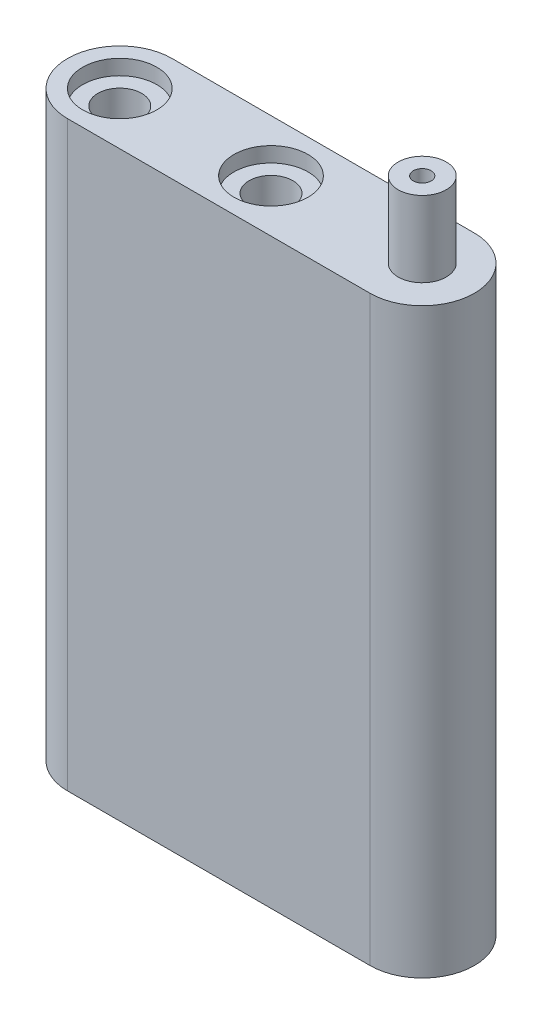
ISO-10303-21;
HEADER;
FILE_DESCRIPTION(('STEP AP214'),'2;1');
FILE_NAME('part.step','',(''),(''),'','','');
FILE_SCHEMA(('AUTOMOTIVE_DESIGN { 1 0 10303 214 1 1 1 1 }'));
ENDSEC;
DATA;
#1=APPLICATION_CONTEXT('core data for automotive mechanical design processes');
#2=APPLICATION_PROTOCOL_DEFINITION('international standard','automotive_design',2000,#1);
#3=PRODUCT_CONTEXT('',#1,'mechanical');
#4=PRODUCT('Part','Part','',(#3));
#5=PRODUCT_RELATED_PRODUCT_CATEGORY('part','',(#4));
#6=PRODUCT_DEFINITION_FORMATION('','',#4);
#7=PRODUCT_DEFINITION_CONTEXT('part definition',#1,'design');
#8=PRODUCT_DEFINITION('design','',#6,#7);
#9=PRODUCT_DEFINITION_SHAPE('','',#8);
#10=(LENGTH_UNIT() NAMED_UNIT(*) SI_UNIT(.MILLI.,.METRE.));
#11=(NAMED_UNIT(*) PLANE_ANGLE_UNIT() SI_UNIT($,.RADIAN.));
#12=(NAMED_UNIT(*) SI_UNIT($,.STERADIAN.) SOLID_ANGLE_UNIT());
#13=UNCERTAINTY_MEASURE_WITH_UNIT(LENGTH_MEASURE(1.E-05),#10,'distance_accuracy_value','');
#14=(GEOMETRIC_REPRESENTATION_CONTEXT(3) GLOBAL_UNCERTAINTY_ASSIGNED_CONTEXT((#13)) GLOBAL_UNIT_ASSIGNED_CONTEXT((#10,
#11,#12)) REPRESENTATION_CONTEXT('',''));
#15=CARTESIAN_POINT('',(0.,0.,0.));
#16=DIRECTION('',(0.,0.,1.));
#17=DIRECTION('',(1.,0.,0.));
#18=AXIS2_PLACEMENT_3D('',#15,#16,#17);
#19=CARTESIAN_POINT('',(0.,2.5,0.));
#20=DIRECTION('',(0.,-1.,0.));
#21=DIRECTION('',(0.,0.,-1.));
#22=AXIS2_PLACEMENT_3D('',#19,#20,#21);
#23=CYLINDRICAL_SURFACE('',#22,1.45);
#24=CARTESIAN_POINT('',(0.,1.5,0.));
#25=DIRECTION('',(0.,1.,0.));
#26=DIRECTION('',(0.,0.,1.));
#27=AXIS2_PLACEMENT_3D('',#24,#25,#26);
#28=CIRCLE('',#27,1.45);
#29=CARTESIAN_POINT('',(0.,1.5,1.45));
#30=VERTEX_POINT('',#29);
#31=EDGE_CURVE('E141',#30,#30,#28,.T.);
#32=ORIENTED_EDGE('',*,*,#31,.T.);
#33=EDGE_LOOP('',(#32));
#34=FACE_BOUND('',#33,.T.);
#35=CARTESIAN_POINT('',(0.,-36.,0.));
#36=DIRECTION('',(0.,-1.,0.));
#37=DIRECTION('',(0.,0.,-1.));
#38=AXIS2_PLACEMENT_3D('',#35,#36,#37);
#39=CIRCLE('',#38,1.45);
#40=CARTESIAN_POINT('',(0.,-36.,-1.45));
#41=VERTEX_POINT('',#40);
#42=EDGE_CURVE('E102',#41,#41,#39,.T.);
#43=ORIENTED_EDGE('',*,*,#42,.T.);
#44=EDGE_LOOP('',(#43));
#45=FACE_BOUND('',#44,.T.);
#46=ADVANCED_FACE('F39',(#34,#45),#23,.F.);
#47=CARTESIAN_POINT('',(10.,2.5,0.));
#48=DIRECTION('',(0.,-1.,0.));
#49=DIRECTION('',(0.,0.,-1.));
#50=AXIS2_PLACEMENT_3D('',#47,#48,#49);
#51=CYLINDRICAL_SURFACE('',#50,1.45);
#52=CARTESIAN_POINT('',(10.,1.5,0.));
#53=DIRECTION('',(0.,1.,0.));
#54=DIRECTION('',(0.,0.,1.));
#55=AXIS2_PLACEMENT_3D('',#52,#53,#54);
#56=CIRCLE('',#55,1.45);
#57=CARTESIAN_POINT('',(10.,1.5,1.45));
#58=VERTEX_POINT('',#57);
#59=EDGE_CURVE('E130',#58,#58,#56,.T.);
#60=ORIENTED_EDGE('',*,*,#59,.T.);
#61=EDGE_LOOP('',(#60));
#62=FACE_BOUND('',#61,.T.);
#63=CARTESIAN_POINT('',(10.,-36.,0.));
#64=DIRECTION('',(0.,-1.,0.));
#65=DIRECTION('',(0.,0.,-1.));
#66=AXIS2_PLACEMENT_3D('',#63,#64,#65);
#67=CIRCLE('',#66,1.45);
#68=CARTESIAN_POINT('',(10.,-36.,-1.45));
#69=VERTEX_POINT('',#68);
#70=EDGE_CURVE('E105',#69,#69,#67,.T.);
#71=ORIENTED_EDGE('',*,*,#70,.T.);
#72=EDGE_LOOP('',(#71));
#73=FACE_BOUND('',#72,.T.);
#74=ADVANCED_FACE('F171',(#62,#73),#51,.F.);
#75=CARTESIAN_POINT('',(0.,2.5,0.));
#76=DIRECTION('',(0.,1.,0.));
#77=DIRECTION('',(0.,0.,1.));
#78=AXIS2_PLACEMENT_3D('',#75,#76,#77);
#79=PLANE('',#78);
#80=CARTESIAN_POINT('',(20.,2.5,0.));
#81=DIRECTION('',(0.,1.,0.));
#82=DIRECTION('',(0.,0.,1.));
#83=AXIS2_PLACEMENT_3D('',#80,#81,#82);
#84=CIRCLE('',#83,1.59);
#85=CARTESIAN_POINT('',(20.,2.5,1.59));
#86=VERTEX_POINT('',#85);
#87=EDGE_CURVE('E120',#86,#86,#84,.T.);
#88=ORIENTED_EDGE('',*,*,#87,.F.);
#89=EDGE_LOOP('',(#88));
#90=FACE_BOUND('',#89,.T.);
#91=CARTESIAN_POINT('',(10.,2.5,0.));
#92=DIRECTION('',(0.,1.,0.));
#93=DIRECTION('',(0.,0.,1.));
#94=AXIS2_PLACEMENT_3D('',#91,#92,#93);
#95=CIRCLE('',#94,2.45);
#96=CARTESIAN_POINT('',(10.,2.5,2.45));
#97=VERTEX_POINT('',#96);
#98=EDGE_CURVE('E131',#97,#97,#95,.T.);
#99=ORIENTED_EDGE('',*,*,#98,.F.);
#100=EDGE_LOOP('',(#99));
#101=FACE_BOUND('',#100,.T.);
#102=CARTESIAN_POINT('',(0.,2.5,0.));
#103=DIRECTION('',(0.,1.,0.));
#104=DIRECTION('',(0.,0.,1.));
#105=AXIS2_PLACEMENT_3D('',#102,#103,#104);
#106=CIRCLE('',#105,2.45);
#107=CARTESIAN_POINT('',(0.,2.5,2.45));
#108=VERTEX_POINT('',#107);
#109=EDGE_CURVE('E134',#108,#108,#106,.T.);
#110=ORIENTED_EDGE('',*,*,#109,.F.);
#111=EDGE_LOOP('',(#110));
#112=FACE_BOUND('',#111,.T.);
#113=CARTESIAN_POINT('',(0.,2.5,0.));
#114=DIRECTION('',(0.,1.,0.));
#115=DIRECTION('',(0.,0.,1.));
#116=AXIS2_PLACEMENT_3D('',#113,#114,#115);
#117=CIRCLE('',#116,3.45);
#118=CARTESIAN_POINT('',(0.,2.5,-3.45));
#119=VERTEX_POINT('',#118);
#120=CARTESIAN_POINT('',(0.,2.5,3.45));
#121=VERTEX_POINT('',#120);
#122=EDGE_CURVE('E85',#119,#121,#117,.T.);
#123=ORIENTED_EDGE('',*,*,#122,.T.);
#124=DIRECTION('',(1.,0.,0.));
#125=VECTOR('',#124,1.);
#126=CARTESIAN_POINT('',(0.,2.5,3.45));
#127=LINE('',#126,#125);
#128=CARTESIAN_POINT('',(20.,2.5,3.45));
#129=VERTEX_POINT('',#128);
#130=EDGE_CURVE('E140',#121,#129,#127,.T.);
#131=ORIENTED_EDGE('',*,*,#130,.T.);
#132=CARTESIAN_POINT('',(20.,2.5,0.));
#133=DIRECTION('',(0.,1.,0.));
#134=DIRECTION('',(0.,0.,1.));
#135=AXIS2_PLACEMENT_3D('',#132,#133,#134);
#136=CIRCLE('',#135,3.45);
#137=CARTESIAN_POINT('',(20.,2.5,-3.45));
#138=VERTEX_POINT('',#137);
#139=EDGE_CURVE('E59',#129,#138,#136,.T.);
#140=ORIENTED_EDGE('',*,*,#139,.T.);
#141=DIRECTION('',(-1.,0.,0.));
#142=VECTOR('',#141,1.);
#143=CARTESIAN_POINT('',(0.,2.5,-3.45));
#144=LINE('',#143,#142);
#145=EDGE_CURVE('E54',#138,#119,#144,.T.);
#146=ORIENTED_EDGE('',*,*,#145,.T.);
#147=EDGE_LOOP('',(#123,#131,#140,#146));
#148=FACE_BOUND('',#147,.T.);
#149=ADVANCED_FACE('F169',(#90,#101,#112,#148),#79,.T.);
#150=CARTESIAN_POINT('',(0.,2.5,0.));
#151=DIRECTION('',(0.,-1.,0.));
#152=DIRECTION('',(0.,0.,-1.));
#153=AXIS2_PLACEMENT_3D('',#150,#151,#152);
#154=CYLINDRICAL_SURFACE('',#153,3.45);
#155=DIRECTION('',(0.,-1.,0.));
#156=VECTOR('',#155,1.);
#157=CARTESIAN_POINT('',(0.,2.5,-3.45));
#158=LINE('',#157,#156);
#159=CARTESIAN_POINT('',(0.,-36.,-3.45));
#160=VERTEX_POINT('',#159);
#161=EDGE_CURVE('E80',#119,#160,#158,.T.);
#162=ORIENTED_EDGE('',*,*,#161,.T.);
#163=CARTESIAN_POINT('',(0.,-36.,0.));
#164=DIRECTION('',(0.,-1.,0.));
#165=DIRECTION('',(0.,0.,-1.));
#166=AXIS2_PLACEMENT_3D('',#163,#164,#165);
#167=CIRCLE('',#166,3.45);
#168=CARTESIAN_POINT('',(0.,-36.,3.45));
#169=VERTEX_POINT('',#168);
#170=EDGE_CURVE('E84',#169,#160,#167,.T.);
#171=ORIENTED_EDGE('',*,*,#170,.F.);
#172=DIRECTION('',(0.,-1.,0.));
#173=VECTOR('',#172,1.);
#174=CARTESIAN_POINT('',(0.,2.5,3.45));
#175=LINE('',#174,#173);
#176=EDGE_CURVE('E47',#121,#169,#175,.T.);
#177=ORIENTED_EDGE('',*,*,#176,.F.);
#178=ORIENTED_EDGE('',*,*,#122,.F.);
#179=EDGE_LOOP('',(#162,#171,#177,#178));
#180=FACE_BOUND('',#179,.T.);
#181=ADVANCED_FACE('F41',(#180),#154,.T.);
#182=CARTESIAN_POINT('',(0.,2.5,3.45));
#183=DIRECTION('',(0.,0.,-1.));
#184=DIRECTION('',(-1.,0.,0.));
#185=AXIS2_PLACEMENT_3D('',#182,#183,#184);
#186=PLANE('',#185);
#187=ORIENTED_EDGE('',*,*,#176,.T.);
#188=DIRECTION('',(-1.,0.,0.));
#189=VECTOR('',#188,1.);
#190=CARTESIAN_POINT('',(20.,-36.,3.45));
#191=LINE('',#190,#189);
#192=CARTESIAN_POINT('',(20.,-36.,3.45));
#193=VERTEX_POINT('',#192);
#194=EDGE_CURVE('E101',#193,#169,#191,.T.);
#195=ORIENTED_EDGE('',*,*,#194,.F.);
#196=DIRECTION('',(0.,-1.,0.));
#197=VECTOR('',#196,1.);
#198=CARTESIAN_POINT('',(20.,2.5,3.45));
#199=LINE('',#198,#197);
#200=EDGE_CURVE('E146',#129,#193,#199,.T.);
#201=ORIENTED_EDGE('',*,*,#200,.F.);
#202=ORIENTED_EDGE('',*,*,#130,.F.);
#203=EDGE_LOOP('',(#187,#195,#201,#202));
#204=FACE_BOUND('',#203,.T.);
#205=ADVANCED_FACE('F177',(#204),#186,.F.);
#206=CARTESIAN_POINT('',(20.,2.5,0.));
#207=DIRECTION('',(0.,-1.,0.));
#208=DIRECTION('',(0.,0.,-1.));
#209=AXIS2_PLACEMENT_3D('',#206,#207,#208);
#210=CYLINDRICAL_SURFACE('',#209,3.45);
#211=ORIENTED_EDGE('',*,*,#200,.T.);
#212=CARTESIAN_POINT('',(20.,-36.,0.));
#213=DIRECTION('',(0.,-1.,0.));
#214=DIRECTION('',(0.,0.,-1.));
#215=AXIS2_PLACEMENT_3D('',#212,#213,#214);
#216=CIRCLE('',#215,3.45);
#217=CARTESIAN_POINT('',(20.,-36.,-3.45));
#218=VERTEX_POINT('',#217);
#219=EDGE_CURVE('E95',#218,#193,#216,.T.);
#220=ORIENTED_EDGE('',*,*,#219,.F.);
#221=DIRECTION('',(0.,-1.,0.));
#222=VECTOR('',#221,1.);
#223=CARTESIAN_POINT('',(20.,2.5,-3.45));
#224=LINE('',#223,#222);
#225=EDGE_CURVE('E87',#138,#218,#224,.T.);
#226=ORIENTED_EDGE('',*,*,#225,.F.);
#227=ORIENTED_EDGE('',*,*,#139,.F.);
#228=EDGE_LOOP('',(#211,#220,#226,#227));
#229=FACE_BOUND('',#228,.T.);
#230=ADVANCED_FACE('F179',(#229),#210,.T.);
#231=CARTESIAN_POINT('',(0.,2.5,-3.45));
#232=DIRECTION('',(0.,0.,1.));
#233=DIRECTION('',(1.,0.,0.));
#234=AXIS2_PLACEMENT_3D('',#231,#232,#233);
#235=PLANE('',#234);
#236=ORIENTED_EDGE('',*,*,#225,.T.);
#237=DIRECTION('',(1.,0.,0.));
#238=VECTOR('',#237,1.);
#239=CARTESIAN_POINT('',(0.,-36.,-3.45));
#240=LINE('',#239,#238);
#241=EDGE_CURVE('E90',#160,#218,#240,.T.);
#242=ORIENTED_EDGE('',*,*,#241,.F.);
#243=ORIENTED_EDGE('',*,*,#161,.F.);
#244=ORIENTED_EDGE('',*,*,#145,.F.);
#245=EDGE_LOOP('',(#236,#242,#243,#244));
#246=FACE_BOUND('',#245,.T.);
#247=ADVANCED_FACE('F91',(#246),#235,.F.);
#248=CARTESIAN_POINT('',(10.,1.5,0.));
#249=DIRECTION('',(0.,1.,0.));
#250=DIRECTION('',(0.,0.,1.));
#251=AXIS2_PLACEMENT_3D('',#248,#249,#250);
#252=CYLINDRICAL_SURFACE('',#251,2.45);
#253=CARTESIAN_POINT('',(10.,1.5,0.));
#254=DIRECTION('',(0.,1.,0.));
#255=DIRECTION('',(0.,0.,1.));
#256=AXIS2_PLACEMENT_3D('',#253,#254,#255);
#257=CIRCLE('',#256,2.45);
#258=CARTESIAN_POINT('',(10.,1.5,2.45));
#259=VERTEX_POINT('',#258);
#260=EDGE_CURVE('E127',#259,#259,#257,.T.);
#261=ORIENTED_EDGE('',*,*,#260,.F.);
#262=EDGE_LOOP('',(#261));
#263=FACE_BOUND('',#262,.T.);
#264=ORIENTED_EDGE('',*,*,#98,.T.);
#265=EDGE_LOOP('',(#264));
#266=FACE_BOUND('',#265,.T.);
#267=ADVANCED_FACE('F186',(#263,#266),#252,.F.);
#268=CARTESIAN_POINT('',(10.,1.5,0.));
#269=DIRECTION('',(0.,1.,0.));
#270=DIRECTION('',(0.,0.,1.));
#271=AXIS2_PLACEMENT_3D('',#268,#269,#270);
#272=PLANE('',#271);
#273=ORIENTED_EDGE('',*,*,#59,.F.);
#274=EDGE_LOOP('',(#273));
#275=FACE_BOUND('',#274,.T.);
#276=ORIENTED_EDGE('',*,*,#260,.T.);
#277=EDGE_LOOP('',(#276));
#278=FACE_BOUND('',#277,.T.);
#279=ADVANCED_FACE('F165',(#275,#278),#272,.T.);
#280=CARTESIAN_POINT('',(0.,1.5,0.));
#281=DIRECTION('',(0.,1.,0.));
#282=DIRECTION('',(0.,0.,1.));
#283=AXIS2_PLACEMENT_3D('',#280,#281,#282);
#284=CYLINDRICAL_SURFACE('',#283,2.45);
#285=CARTESIAN_POINT('',(0.,1.5,0.));
#286=DIRECTION('',(0.,1.,0.));
#287=DIRECTION('',(0.,0.,1.));
#288=AXIS2_PLACEMENT_3D('',#285,#286,#287);
#289=CIRCLE('',#288,2.45);
#290=CARTESIAN_POINT('',(0.,1.5,2.45));
#291=VERTEX_POINT('',#290);
#292=EDGE_CURVE('E124',#291,#291,#289,.T.);
#293=ORIENTED_EDGE('',*,*,#292,.F.);
#294=EDGE_LOOP('',(#293));
#295=FACE_BOUND('',#294,.T.);
#296=ORIENTED_EDGE('',*,*,#109,.T.);
#297=EDGE_LOOP('',(#296));
#298=FACE_BOUND('',#297,.T.);
#299=ADVANCED_FACE('F159',(#295,#298),#284,.F.);
#300=CARTESIAN_POINT('',(0.,1.5,0.));
#301=DIRECTION('',(0.,1.,0.));
#302=DIRECTION('',(0.,0.,1.));
#303=AXIS2_PLACEMENT_3D('',#300,#301,#302);
#304=PLANE('',#303);
#305=ORIENTED_EDGE('',*,*,#31,.F.);
#306=EDGE_LOOP('',(#305));
#307=FACE_BOUND('',#306,.T.);
#308=ORIENTED_EDGE('',*,*,#292,.T.);
#309=EDGE_LOOP('',(#308));
#310=FACE_BOUND('',#309,.T.);
#311=ADVANCED_FACE('F155',(#307,#310),#304,.T.);
#312=CARTESIAN_POINT('',(20.,7.5,0.));
#313=DIRECTION('',(0.,1.,0.));
#314=DIRECTION('',(0.,0.,1.));
#315=AXIS2_PLACEMENT_3D('',#312,#313,#314);
#316=PLANE('',#315);
#317=CARTESIAN_POINT('',(20.,7.5,0.));
#318=DIRECTION('',(0.,1.,0.));
#319=DIRECTION('',(0.,0.,1.));
#320=AXIS2_PLACEMENT_3D('',#317,#318,#319);
#321=CIRCLE('',#320,1.59);
#322=CARTESIAN_POINT('',(20.,7.5,1.59));
#323=VERTEX_POINT('',#322);
#324=EDGE_CURVE('E121',#323,#323,#321,.T.);
#325=ORIENTED_EDGE('',*,*,#324,.T.);
#326=EDGE_LOOP('',(#325));
#327=FACE_BOUND('',#326,.T.);
#328=CARTESIAN_POINT('',(20.,7.5,0.));
#329=DIRECTION('',(0.,1.,0.));
#330=DIRECTION('',(0.,0.,1.));
#331=AXIS2_PLACEMENT_3D('',#328,#329,#330);
#332=CIRCLE('',#331,0.59);
#333=CARTESIAN_POINT('',(20.,7.5,0.59));
#334=VERTEX_POINT('',#333);
#335=EDGE_CURVE('E115',#334,#334,#332,.T.);
#336=ORIENTED_EDGE('',*,*,#335,.F.);
#337=EDGE_LOOP('',(#336));
#338=FACE_BOUND('',#337,.T.);
#339=ADVANCED_FACE('F158',(#327,#338),#316,.T.);
#340=CARTESIAN_POINT('',(20.,7.5,0.));
#341=DIRECTION('',(0.,-1.,0.));
#342=DIRECTION('',(0.,0.,-1.));
#343=AXIS2_PLACEMENT_3D('',#340,#341,#342);
#344=CYLINDRICAL_SURFACE('',#343,1.59);
#345=ORIENTED_EDGE('',*,*,#324,.F.);
#346=EDGE_LOOP('',(#345));
#347=FACE_BOUND('',#346,.T.);
#348=ORIENTED_EDGE('',*,*,#87,.T.);
#349=EDGE_LOOP('',(#348));
#350=FACE_BOUND('',#349,.T.);
#351=ADVANCED_FACE('F203',(#347,#350),#344,.T.);
#352=CARTESIAN_POINT('',(20.,7.5,0.));
#353=DIRECTION('',(0.,-1.,0.));
#354=DIRECTION('',(0.,0.,-1.));
#355=AXIS2_PLACEMENT_3D('',#352,#353,#354);
#356=CYLINDRICAL_SURFACE('',#355,0.59);
#357=ORIENTED_EDGE('',*,*,#335,.T.);
#358=EDGE_LOOP('',(#357));
#359=FACE_BOUND('',#358,.T.);
#360=CARTESIAN_POINT('',(20.,2.5,0.));
#361=DIRECTION('',(0.,1.,0.));
#362=DIRECTION('',(0.,0.,1.));
#363=AXIS2_PLACEMENT_3D('',#360,#361,#362);
#364=CIRCLE('',#363,0.59);
#365=CARTESIAN_POINT('',(20.,2.5,0.59));
#366=VERTEX_POINT('',#365);
#367=EDGE_CURVE('E11',#366,#366,#364,.F.);
#368=ORIENTED_EDGE('',*,*,#367,.T.);
#369=EDGE_LOOP('',(#368));
#370=FACE_BOUND('',#369,.T.);
#371=ADVANCED_FACE('F206',(#359,#370),#356,.F.);
#372=CARTESIAN_POINT('',(20.,2.5,0.));
#373=DIRECTION('',(0.,1.,0.));
#374=DIRECTION('',(0.,0.,1.));
#375=AXIS2_PLACEMENT_3D('',#372,#373,#374);
#376=CIRCLE('',#375,0.475000000000004);
#377=CARTESIAN_POINT('',(20.,2.5,0.475000000000004));
#378=VERTEX_POINT('',#377);
#379=EDGE_CURVE('E111',#378,#378,#376,.T.);
#380=ORIENTED_EDGE('',*,*,#379,.F.);
#381=EDGE_LOOP('',(#380));
#382=FACE_BOUND('',#381,.T.);
#383=ORIENTED_EDGE('',*,*,#367,.F.);
#384=EDGE_LOOP('',(#383));
#385=FACE_BOUND('',#384,.T.);
#386=ADVANCED_FACE('F174',(#382,#385),#79,.T.);
#387=CARTESIAN_POINT('',(20.,0.,0.));
#388=DIRECTION('',(0.,1.,0.));
#389=DIRECTION('',(0.,0.,1.));
#390=AXIS2_PLACEMENT_3D('',#387,#388,#389);
#391=CYLINDRICAL_SURFACE('',#390,0.475000000000004);
#392=CARTESIAN_POINT('',(20.,0.,0.));
#393=DIRECTION('',(0.,1.,0.));
#394=DIRECTION('',(0.,0.,1.));
#395=AXIS2_PLACEMENT_3D('',#392,#393,#394);
#396=CIRCLE('',#395,0.475000000000004);
#397=CARTESIAN_POINT('',(20.,0.,0.475000000000004));
#398=VERTEX_POINT('',#397);
#399=EDGE_CURVE('E112',#398,#398,#396,.T.);
#400=ORIENTED_EDGE('',*,*,#399,.F.);
#401=EDGE_LOOP('',(#400));
#402=FACE_BOUND('',#401,.T.);
#403=ORIENTED_EDGE('',*,*,#379,.T.);
#404=EDGE_LOOP('',(#403));
#405=FACE_BOUND('',#404,.T.);
#406=ADVANCED_FACE('F214',(#402,#405),#391,.F.);
#407=CARTESIAN_POINT('',(0.,0.,0.));
#408=DIRECTION('',(0.,-1.,0.));
#409=DIRECTION('',(0.,0.,-1.));
#410=AXIS2_PLACEMENT_3D('',#407,#408,#409);
#411=PLANE('',#410);
#412=ORIENTED_EDGE('',*,*,#399,.T.);
#413=EDGE_LOOP('',(#412));
#414=FACE_BOUND('',#413,.T.);
#415=ADVANCED_FACE('F216',(#414),#411,.F.);
#416=CARTESIAN_POINT('',(0.,-36.,0.));
#417=DIRECTION('',(0.,-1.,0.));
#418=DIRECTION('',(0.,0.,-1.));
#419=AXIS2_PLACEMENT_3D('',#416,#417,#418);
#420=PLANE('',#419);
#421=ORIENTED_EDGE('',*,*,#42,.F.);
#422=EDGE_LOOP('',(#421));
#423=FACE_BOUND('',#422,.T.);
#424=ORIENTED_EDGE('',*,*,#170,.T.);
#425=ORIENTED_EDGE('',*,*,#241,.T.);
#426=ORIENTED_EDGE('',*,*,#219,.T.);
#427=ORIENTED_EDGE('',*,*,#194,.T.);
#428=EDGE_LOOP('',(#424,#425,#426,#427));
#429=FACE_BOUND('',#428,.T.);
#430=ORIENTED_EDGE('',*,*,#70,.F.);
#431=EDGE_LOOP('',(#430));
#432=FACE_BOUND('',#431,.T.);
#433=ADVANCED_FACE('F98',(#423,#429,#432),#420,.T.);
#434=CLOSED_SHELL('',(#46,#74,#149,#181,#205,#230,#247,#267,#279,#299,#311,#339,#351,#371,#386,
#406,#415,#433));
#435=MANIFOLD_SOLID_BREP('B2',#434);
#436=ADVANCED_BREP_SHAPE_REPRESENTATION('',(#18,#435),#14);
#437=SHAPE_DEFINITION_REPRESENTATION(#9,#436);
ENDSEC;
END-ISO-10303-21;
